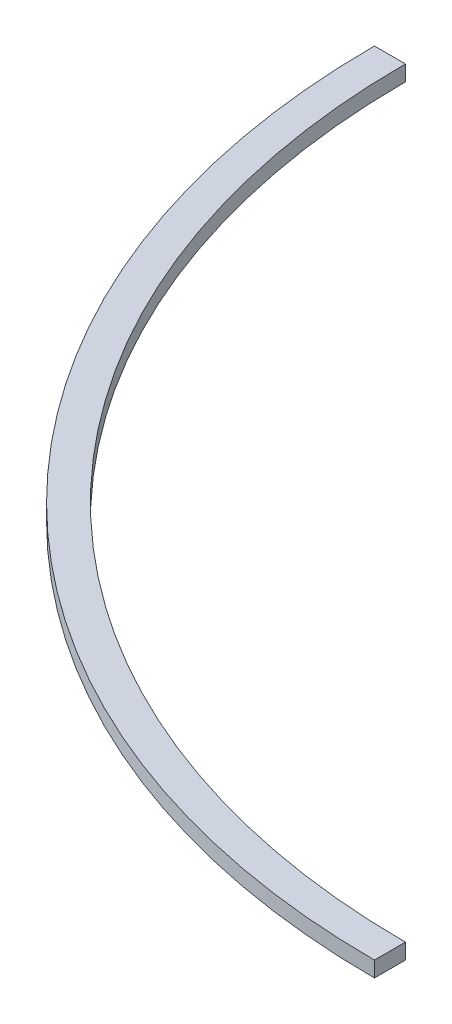
ISO-10303-21;
HEADER;
FILE_DESCRIPTION(('STEP AP214'),'2;1');
FILE_NAME('part.step','',(''),(''),'','','');
FILE_SCHEMA(('AUTOMOTIVE_DESIGN { 1 0 10303 214 1 1 1 1 }'));
ENDSEC;
DATA;
#1=APPLICATION_CONTEXT('core data for automotive mechanical design processes');
#2=APPLICATION_PROTOCOL_DEFINITION('international standard','automotive_design',2000,#1);
#3=PRODUCT_CONTEXT('',#1,'mechanical');
#4=PRODUCT('Part','Part','',(#3));
#5=PRODUCT_RELATED_PRODUCT_CATEGORY('part','',(#4));
#6=PRODUCT_DEFINITION_FORMATION('','',#4);
#7=PRODUCT_DEFINITION_CONTEXT('part definition',#1,'design');
#8=PRODUCT_DEFINITION('design','',#6,#7);
#9=PRODUCT_DEFINITION_SHAPE('','',#8);
#10=(LENGTH_UNIT() NAMED_UNIT(*) SI_UNIT(.MILLI.,.METRE.));
#11=(NAMED_UNIT(*) PLANE_ANGLE_UNIT() SI_UNIT($,.RADIAN.));
#12=(NAMED_UNIT(*) SI_UNIT($,.STERADIAN.) SOLID_ANGLE_UNIT());
#13=UNCERTAINTY_MEASURE_WITH_UNIT(LENGTH_MEASURE(1.E-05),#10,'distance_accuracy_value','');
#14=(GEOMETRIC_REPRESENTATION_CONTEXT(3) GLOBAL_UNCERTAINTY_ASSIGNED_CONTEXT((#13)) GLOBAL_UNIT_ASSIGNED_CONTEXT((#10,
#11,#12)) REPRESENTATION_CONTEXT('',''));
#15=CARTESIAN_POINT('',(0.,0.,0.));
#16=DIRECTION('',(0.,0.,1.));
#17=DIRECTION('',(1.,0.,0.));
#18=AXIS2_PLACEMENT_3D('',#15,#16,#17);
#19=CARTESIAN_POINT('',(0.,10.,0.));
#20=DIRECTION('',(0.,-1.,0.));
#21=DIRECTION('',(0.,0.,-1.));
#22=AXIS2_PLACEMENT_3D('',#19,#20,#21);
#23=CYLINDRICAL_SURFACE('',#22,490.);
#24=CARTESIAN_POINT('',(0.,0.,0.));
#25=DIRECTION('',(0.,1.,0.));
#26=DIRECTION('',(0.,0.,1.));
#27=AXIS2_PLACEMENT_3D('',#24,#25,#26);
#28=CIRCLE('',#27,490.);
#29=CARTESIAN_POINT('',(-490.,0.,0.));
#30=VERTEX_POINT('',#29);
#31=CARTESIAN_POINT('',(0.,0.,490.));
#32=VERTEX_POINT('',#31);
#33=EDGE_CURVE('E100',#30,#32,#28,.T.);
#34=ORIENTED_EDGE('',*,*,#33,.F.);
#35=DIRECTION('',(0.,-1.,0.));
#36=VECTOR('',#35,1.);
#37=CARTESIAN_POINT('',(-490.,10.,0.));
#38=LINE('',#37,#36);
#39=CARTESIAN_POINT('',(-490.,10.,0.));
#40=VERTEX_POINT('',#39);
#41=EDGE_CURVE('E11',#40,#30,#38,.T.);
#42=ORIENTED_EDGE('',*,*,#41,.F.);
#43=CARTESIAN_POINT('',(0.,10.,0.));
#44=DIRECTION('',(0.,1.,0.));
#45=DIRECTION('',(0.,0.,1.));
#46=AXIS2_PLACEMENT_3D('',#43,#44,#45);
#47=CIRCLE('',#46,490.);
#48=CARTESIAN_POINT('',(0.,10.,490.));
#49=VERTEX_POINT('',#48);
#50=EDGE_CURVE('E85',#40,#49,#47,.T.);
#51=ORIENTED_EDGE('',*,*,#50,.T.);
#52=DIRECTION('',(0.,-1.,0.));
#53=VECTOR('',#52,1.);
#54=CARTESIAN_POINT('',(0.,10.,490.));
#55=LINE('',#54,#53);
#56=EDGE_CURVE('E53',#49,#32,#55,.T.);
#57=ORIENTED_EDGE('',*,*,#56,.T.);
#58=EDGE_LOOP('',(#34,#42,#51,#57));
#59=FACE_BOUND('',#58,.T.);
#60=ADVANCED_FACE('F37',(#59),#23,.F.);
#61=CARTESIAN_POINT('',(0.,10.,0.));
#62=DIRECTION('',(0.,0.,1.));
#63=DIRECTION('',(1.,0.,0.));
#64=AXIS2_PLACEMENT_3D('',#61,#62,#63);
#65=PLANE('',#64);
#66=DIRECTION('',(-1.,0.,0.));
#67=VECTOR('',#66,1.);
#68=CARTESIAN_POINT('',(0.,0.,0.));
#69=LINE('',#68,#67);
#70=CARTESIAN_POINT('',(-510.,0.,0.));
#71=VERTEX_POINT('',#70);
#72=EDGE_CURVE('E91',#30,#71,#69,.T.);
#73=ORIENTED_EDGE('',*,*,#72,.T.);
#74=DIRECTION('',(0.,-1.,0.));
#75=VECTOR('',#74,1.);
#76=CARTESIAN_POINT('',(-510.,10.,0.));
#77=LINE('',#76,#75);
#78=CARTESIAN_POINT('',(-510.,10.,0.));
#79=VERTEX_POINT('',#78);
#80=EDGE_CURVE('E45',#79,#71,#77,.T.);
#81=ORIENTED_EDGE('',*,*,#80,.F.);
#82=DIRECTION('',(-1.,0.,0.));
#83=VECTOR('',#82,1.);
#84=CARTESIAN_POINT('',(0.,10.,0.));
#85=LINE('',#84,#83);
#86=EDGE_CURVE('E79',#40,#79,#85,.T.);
#87=ORIENTED_EDGE('',*,*,#86,.F.);
#88=ORIENTED_EDGE('',*,*,#41,.T.);
#89=EDGE_LOOP('',(#73,#81,#87,#88));
#90=FACE_BOUND('',#89,.T.);
#91=ADVANCED_FACE('F89',(#90),#65,.F.);
#92=CARTESIAN_POINT('',(0.,10.,0.));
#93=DIRECTION('',(0.,-1.,0.));
#94=DIRECTION('',(0.,0.,-1.));
#95=AXIS2_PLACEMENT_3D('',#92,#93,#94);
#96=CYLINDRICAL_SURFACE('',#95,510.);
#97=CARTESIAN_POINT('',(0.,0.,0.));
#98=DIRECTION('',(0.,1.,0.));
#99=DIRECTION('',(0.,0.,1.));
#100=AXIS2_PLACEMENT_3D('',#97,#98,#99);
#101=CIRCLE('',#100,510.);
#102=CARTESIAN_POINT('',(0.,0.,510.));
#103=VERTEX_POINT('',#102);
#104=EDGE_CURVE('E103',#71,#103,#101,.T.);
#105=ORIENTED_EDGE('',*,*,#104,.T.);
#106=DIRECTION('',(0.,-1.,0.));
#107=VECTOR('',#106,1.);
#108=CARTESIAN_POINT('',(0.,10.,510.));
#109=LINE('',#108,#107);
#110=CARTESIAN_POINT('',(0.,10.,510.));
#111=VERTEX_POINT('',#110);
#112=EDGE_CURVE('E67',#111,#103,#109,.T.);
#113=ORIENTED_EDGE('',*,*,#112,.F.);
#114=CARTESIAN_POINT('',(0.,10.,0.));
#115=DIRECTION('',(0.,1.,0.));
#116=DIRECTION('',(0.,0.,1.));
#117=AXIS2_PLACEMENT_3D('',#114,#115,#116);
#118=CIRCLE('',#117,510.);
#119=EDGE_CURVE('E84',#79,#111,#118,.T.);
#120=ORIENTED_EDGE('',*,*,#119,.F.);
#121=ORIENTED_EDGE('',*,*,#80,.T.);
#122=EDGE_LOOP('',(#105,#113,#120,#121));
#123=FACE_BOUND('',#122,.T.);
#124=ADVANCED_FACE('F94',(#123),#96,.T.);
#125=CARTESIAN_POINT('',(0.,10.,0.));
#126=DIRECTION('',(1.,0.,0.));
#127=DIRECTION('',(0.,0.,-1.));
#128=AXIS2_PLACEMENT_3D('',#125,#126,#127);
#129=PLANE('',#128);
#130=DIRECTION('',(0.,0.,1.));
#131=VECTOR('',#130,1.);
#132=CARTESIAN_POINT('',(0.,0.,0.));
#133=LINE('',#132,#131);
#134=EDGE_CURVE('E105',#32,#103,#133,.T.);
#135=ORIENTED_EDGE('',*,*,#134,.F.);
#136=ORIENTED_EDGE('',*,*,#56,.F.);
#137=DIRECTION('',(0.,0.,1.));
#138=VECTOR('',#137,1.);
#139=CARTESIAN_POINT('',(0.,10.,0.));
#140=LINE('',#139,#138);
#141=EDGE_CURVE('E95',#49,#111,#140,.T.);
#142=ORIENTED_EDGE('',*,*,#141,.T.);
#143=ORIENTED_EDGE('',*,*,#112,.T.);
#144=EDGE_LOOP('',(#135,#136,#142,#143));
#145=FACE_BOUND('',#144,.T.);
#146=ADVANCED_FACE('F110',(#145),#129,.T.);
#147=CARTESIAN_POINT('',(0.,10.,0.));
#148=DIRECTION('',(0.,1.,0.));
#149=DIRECTION('',(0.,0.,1.));
#150=AXIS2_PLACEMENT_3D('',#147,#148,#149);
#151=PLANE('',#150);
#152=ORIENTED_EDGE('',*,*,#50,.F.);
#153=ORIENTED_EDGE('',*,*,#86,.T.);
#154=ORIENTED_EDGE('',*,*,#119,.T.);
#155=ORIENTED_EDGE('',*,*,#141,.F.);
#156=EDGE_LOOP('',(#152,#153,#154,#155));
#157=FACE_BOUND('',#156,.T.);
#158=ADVANCED_FACE('F81',(#157),#151,.T.);
#159=CARTESIAN_POINT('',(0.,0.,0.));
#160=DIRECTION('',(0.,1.,0.));
#161=DIRECTION('',(0.,0.,1.));
#162=AXIS2_PLACEMENT_3D('',#159,#160,#161);
#163=PLANE('',#162);
#164=ORIENTED_EDGE('',*,*,#33,.T.);
#165=ORIENTED_EDGE('',*,*,#134,.T.);
#166=ORIENTED_EDGE('',*,*,#104,.F.);
#167=ORIENTED_EDGE('',*,*,#72,.F.);
#168=EDGE_LOOP('',(#164,#165,#166,#167));
#169=FACE_BOUND('',#168,.T.);
#170=ADVANCED_FACE('F117',(#169),#163,.F.);
#171=CLOSED_SHELL('',(#60,#91,#124,#146,#158,#170));
#172=MANIFOLD_SOLID_BREP('B2',#171);
#173=ADVANCED_BREP_SHAPE_REPRESENTATION('',(#18,#172),#14);
#174=SHAPE_DEFINITION_REPRESENTATION(#9,#173);
ENDSEC;
END-ISO-10303-21;
